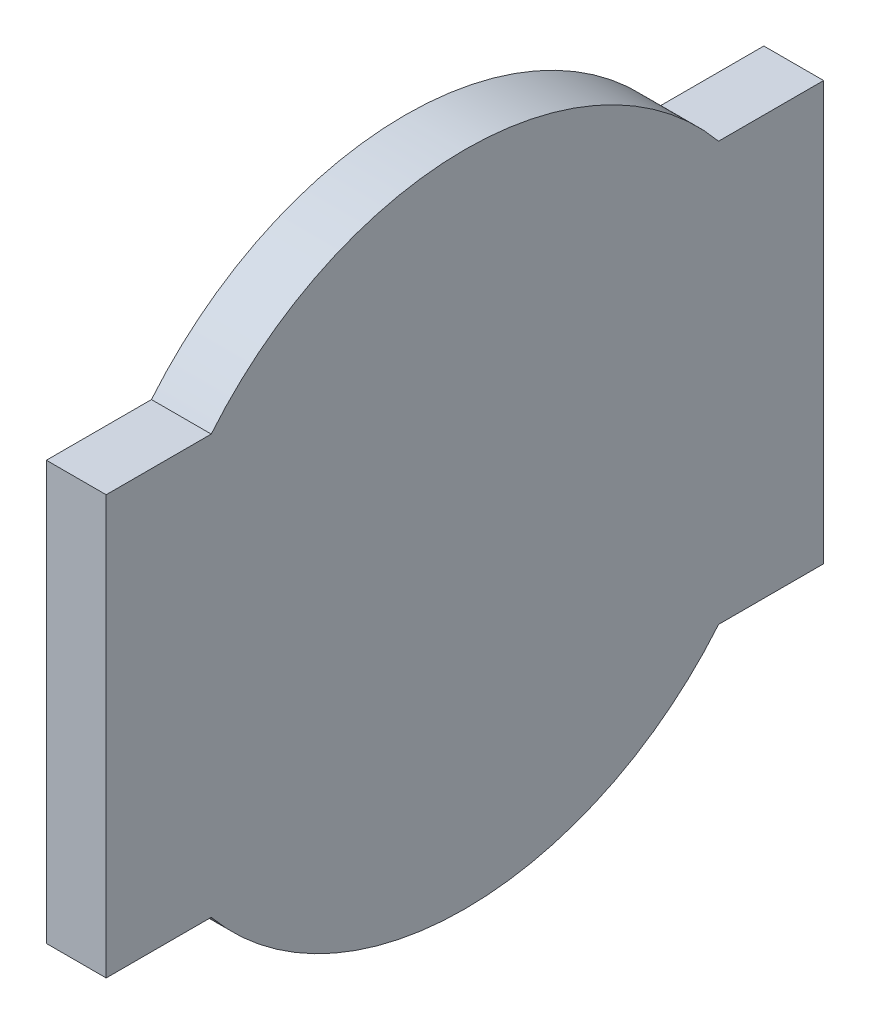
ISO-10303-21;
HEADER;
FILE_DESCRIPTION(('STEP AP214'),'2;1');
FILE_NAME('part.step','',(''),(''),'','','');
FILE_SCHEMA(('AUTOMOTIVE_DESIGN { 1 0 10303 214 1 1 1 1 }'));
ENDSEC;
DATA;
#1=APPLICATION_CONTEXT('core data for automotive mechanical design processes');
#2=APPLICATION_PROTOCOL_DEFINITION('international standard','automotive_design',2000,#1);
#3=PRODUCT_CONTEXT('',#1,'mechanical');
#4=PRODUCT('Part','Part','',(#3));
#5=PRODUCT_RELATED_PRODUCT_CATEGORY('part','',(#4));
#6=PRODUCT_DEFINITION_FORMATION('','',#4);
#7=PRODUCT_DEFINITION_CONTEXT('part definition',#1,'design');
#8=PRODUCT_DEFINITION('design','',#6,#7);
#9=PRODUCT_DEFINITION_SHAPE('','',#8);
#10=(LENGTH_UNIT() NAMED_UNIT(*) SI_UNIT(.MILLI.,.METRE.));
#11=(NAMED_UNIT(*) PLANE_ANGLE_UNIT() SI_UNIT($,.RADIAN.));
#12=(NAMED_UNIT(*) SI_UNIT($,.STERADIAN.) SOLID_ANGLE_UNIT());
#13=UNCERTAINTY_MEASURE_WITH_UNIT(LENGTH_MEASURE(1.E-05),#10,'distance_accuracy_value','');
#14=(GEOMETRIC_REPRESENTATION_CONTEXT(3) GLOBAL_UNCERTAINTY_ASSIGNED_CONTEXT((#13)) GLOBAL_UNIT_ASSIGNED_CONTEXT((#10,
#11,#12)) REPRESENTATION_CONTEXT('',''));
#15=CARTESIAN_POINT('',(0.,0.,0.));
#16=DIRECTION('',(0.,0.,1.));
#17=DIRECTION('',(1.,0.,0.));
#18=AXIS2_PLACEMENT_3D('',#15,#16,#17);
#19=CARTESIAN_POINT('',(6.35,22.225,0.));
#20=DIRECTION('',(0.,1.,0.));
#21=DIRECTION('',(0.,0.,1.));
#22=AXIS2_PLACEMENT_3D('',#19,#20,#21);
#23=PLANE('',#22);
#24=DIRECTION('',(0.,0.,-1.));
#25=VECTOR('',#24,1.);
#26=CARTESIAN_POINT('',(0.,22.225,0.));
#27=LINE('',#26,#25);
#28=CARTESIAN_POINT('',(0.,22.225,-26.9407683632075));
#29=VERTEX_POINT('',#28);
#30=CARTESIAN_POINT('',(0.,22.225,-38.1));
#31=VERTEX_POINT('',#30);
#32=EDGE_CURVE('E131',#29,#31,#27,.T.);
#33=ORIENTED_EDGE('',*,*,#32,.F.);
#34=DIRECTION('',(-1.,0.,0.));
#35=VECTOR('',#34,1.);
#36=CARTESIAN_POINT('',(6.35,22.225,-26.9407683632075));
#37=LINE('',#36,#35);
#38=CARTESIAN_POINT('',(6.35,22.225,-26.9407683632075));
#39=VERTEX_POINT('',#38);
#40=EDGE_CURVE('E11',#39,#29,#37,.T.);
#41=ORIENTED_EDGE('',*,*,#40,.F.);
#42=DIRECTION('',(0.,0.,-1.));
#43=VECTOR('',#42,1.);
#44=CARTESIAN_POINT('',(6.35,22.225,0.));
#45=LINE('',#44,#43);
#46=CARTESIAN_POINT('',(6.35,22.225,-38.1));
#47=VERTEX_POINT('',#46);
#48=EDGE_CURVE('E149',#39,#47,#45,.T.);
#49=ORIENTED_EDGE('',*,*,#48,.T.);
#50=DIRECTION('',(-1.,0.,0.));
#51=VECTOR('',#50,1.);
#52=CARTESIAN_POINT('',(6.35,22.225,-38.1));
#53=LINE('',#52,#51);
#54=EDGE_CURVE('E88',#47,#31,#53,.T.);
#55=ORIENTED_EDGE('',*,*,#54,.T.);
#56=EDGE_LOOP('',(#33,#41,#49,#55));
#57=FACE_BOUND('',#56,.T.);
#58=ADVANCED_FACE('F37',(#57),#23,.T.);
#59=CARTESIAN_POINT('',(6.35,0.,0.));
#60=DIRECTION('',(-1.,0.,0.));
#61=DIRECTION('',(0.,0.,1.));
#62=AXIS2_PLACEMENT_3D('',#59,#60,#61);
#63=CYLINDRICAL_SURFACE('',#62,34.925);
#64=CARTESIAN_POINT('',(0.,0.,0.));
#65=DIRECTION('',(1.,0.,0.));
#66=DIRECTION('',(0.,0.,-1.));
#67=AXIS2_PLACEMENT_3D('',#64,#65,#66);
#68=CIRCLE('',#67,34.925);
#69=CARTESIAN_POINT('',(0.,22.225,26.9407683632075));
#70=VERTEX_POINT('',#69);
#71=EDGE_CURVE('E134',#29,#70,#68,.T.);
#72=ORIENTED_EDGE('',*,*,#71,.T.);
#73=DIRECTION('',(-1.,0.,0.));
#74=VECTOR('',#73,1.);
#75=CARTESIAN_POINT('',(6.35,22.225,26.9407683632075));
#76=LINE('',#75,#74);
#77=CARTESIAN_POINT('',(6.35,22.225,26.9407683632075));
#78=VERTEX_POINT('',#77);
#79=EDGE_CURVE('E45',#78,#70,#76,.T.);
#80=ORIENTED_EDGE('',*,*,#79,.F.);
#81=CARTESIAN_POINT('',(6.35,0.,0.));
#82=DIRECTION('',(1.,0.,0.));
#83=DIRECTION('',(0.,0.,-1.));
#84=AXIS2_PLACEMENT_3D('',#81,#82,#83);
#85=CIRCLE('',#84,34.925);
#86=EDGE_CURVE('E174',#39,#78,#85,.T.);
#87=ORIENTED_EDGE('',*,*,#86,.F.);
#88=ORIENTED_EDGE('',*,*,#40,.T.);
#89=EDGE_LOOP('',(#72,#80,#87,#88));
#90=FACE_BOUND('',#89,.T.);
#91=ADVANCED_FACE('F165',(#90),#63,.T.);
#92=CARTESIAN_POINT('',(6.35,22.225,0.));
#93=DIRECTION('',(0.,1.,0.));
#94=DIRECTION('',(0.,0.,1.));
#95=AXIS2_PLACEMENT_3D('',#92,#93,#94);
#96=PLANE('',#95);
#97=DIRECTION('',(0.,0.,-1.));
#98=VECTOR('',#97,1.);
#99=CARTESIAN_POINT('',(0.,22.225,0.));
#100=LINE('',#99,#98);
#101=CARTESIAN_POINT('',(0.,22.225,38.1));
#102=VERTEX_POINT('',#101);
#103=EDGE_CURVE('E137',#102,#70,#100,.T.);
#104=ORIENTED_EDGE('',*,*,#103,.F.);
#105=DIRECTION('',(-1.,0.,0.));
#106=VECTOR('',#105,1.);
#107=CARTESIAN_POINT('',(6.35,22.225,38.1));
#108=LINE('',#107,#106);
#109=CARTESIAN_POINT('',(6.35,22.225,38.1));
#110=VERTEX_POINT('',#109);
#111=EDGE_CURVE('E155',#110,#102,#108,.T.);
#112=ORIENTED_EDGE('',*,*,#111,.F.);
#113=DIRECTION('',(0.,0.,-1.));
#114=VECTOR('',#113,1.);
#115=CARTESIAN_POINT('',(6.35,22.225,0.));
#116=LINE('',#115,#114);
#117=EDGE_CURVE('E162',#110,#78,#116,.T.);
#118=ORIENTED_EDGE('',*,*,#117,.T.);
#119=ORIENTED_EDGE('',*,*,#79,.T.);
#120=EDGE_LOOP('',(#104,#112,#118,#119));
#121=FACE_BOUND('',#120,.T.);
#122=ADVANCED_FACE('F160',(#121),#96,.T.);
#123=CARTESIAN_POINT('',(6.35,0.,38.1));
#124=DIRECTION('',(0.,0.,1.));
#125=DIRECTION('',(1.,0.,0.));
#126=AXIS2_PLACEMENT_3D('',#123,#124,#125);
#127=PLANE('',#126);
#128=DIRECTION('',(0.,1.,0.));
#129=VECTOR('',#128,1.);
#130=CARTESIAN_POINT('',(0.,0.,38.1));
#131=LINE('',#130,#129);
#132=CARTESIAN_POINT('',(0.,-22.225,38.1));
#133=VERTEX_POINT('',#132);
#134=EDGE_CURVE('E140',#133,#102,#131,.T.);
#135=ORIENTED_EDGE('',*,*,#134,.F.);
#136=DIRECTION('',(-1.,0.,0.));
#137=VECTOR('',#136,1.);
#138=CARTESIAN_POINT('',(6.35,-22.225,38.1));
#139=LINE('',#138,#137);
#140=CARTESIAN_POINT('',(6.35,-22.225,38.1));
#141=VERTEX_POINT('',#140);
#142=EDGE_CURVE('E153',#141,#133,#139,.T.);
#143=ORIENTED_EDGE('',*,*,#142,.F.);
#144=DIRECTION('',(0.,1.,0.));
#145=VECTOR('',#144,1.);
#146=CARTESIAN_POINT('',(6.35,0.,38.1));
#147=LINE('',#146,#145);
#148=EDGE_CURVE('E173',#141,#110,#147,.T.);
#149=ORIENTED_EDGE('',*,*,#148,.T.);
#150=ORIENTED_EDGE('',*,*,#111,.T.);
#151=EDGE_LOOP('',(#135,#143,#149,#150));
#152=FACE_BOUND('',#151,.T.);
#153=ADVANCED_FACE('F171',(#152),#127,.T.);
#154=CARTESIAN_POINT('',(6.35,-22.225,0.));
#155=DIRECTION('',(0.,1.,0.));
#156=DIRECTION('',(0.,0.,1.));
#157=AXIS2_PLACEMENT_3D('',#154,#155,#156);
#158=PLANE('',#157);
#159=DIRECTION('',(0.,0.,-1.));
#160=VECTOR('',#159,1.);
#161=CARTESIAN_POINT('',(0.,-22.225,0.));
#162=LINE('',#161,#160);
#163=CARTESIAN_POINT('',(0.,-22.225,26.9407683632075));
#164=VERTEX_POINT('',#163);
#165=EDGE_CURVE('E143',#133,#164,#162,.T.);
#166=ORIENTED_EDGE('',*,*,#165,.T.);
#167=DIRECTION('',(-1.,0.,0.));
#168=VECTOR('',#167,1.);
#169=CARTESIAN_POINT('',(6.35,-22.225,26.9407683632075));
#170=LINE('',#169,#168);
#171=CARTESIAN_POINT('',(6.35,-22.225,26.9407683632075));
#172=VERTEX_POINT('',#171);
#173=EDGE_CURVE('E123',#172,#164,#170,.T.);
#174=ORIENTED_EDGE('',*,*,#173,.F.);
#175=DIRECTION('',(0.,0.,-1.));
#176=VECTOR('',#175,1.);
#177=CARTESIAN_POINT('',(6.35,-22.225,0.));
#178=LINE('',#177,#176);
#179=EDGE_CURVE('E114',#141,#172,#178,.T.);
#180=ORIENTED_EDGE('',*,*,#179,.F.);
#181=ORIENTED_EDGE('',*,*,#142,.T.);
#182=EDGE_LOOP('',(#166,#174,#180,#181));
#183=FACE_BOUND('',#182,.T.);
#184=ADVANCED_FACE('F190',(#183),#158,.F.);
#185=CARTESIAN_POINT('',(6.35,0.,0.));
#186=DIRECTION('',(-1.,0.,0.));
#187=DIRECTION('',(0.,0.,1.));
#188=AXIS2_PLACEMENT_3D('',#185,#186,#187);
#189=CYLINDRICAL_SURFACE('',#188,34.925);
#190=CARTESIAN_POINT('',(0.,0.,0.));
#191=DIRECTION('',(1.,0.,0.));
#192=DIRECTION('',(0.,0.,-1.));
#193=AXIS2_PLACEMENT_3D('',#190,#191,#192);
#194=CIRCLE('',#193,34.925);
#195=CARTESIAN_POINT('',(0.,-22.225,-26.9407683632075));
#196=VERTEX_POINT('',#195);
#197=EDGE_CURVE('E122',#164,#196,#194,.T.);
#198=ORIENTED_EDGE('',*,*,#197,.T.);
#199=DIRECTION('',(-1.,0.,0.));
#200=VECTOR('',#199,1.);
#201=CARTESIAN_POINT('',(6.35,-22.225,-26.9407683632075));
#202=LINE('',#201,#200);
#203=CARTESIAN_POINT('',(6.35,-22.225,-26.9407683632075));
#204=VERTEX_POINT('',#203);
#205=EDGE_CURVE('E119',#204,#196,#202,.T.);
#206=ORIENTED_EDGE('',*,*,#205,.F.);
#207=CARTESIAN_POINT('',(6.35,0.,0.));
#208=DIRECTION('',(1.,0.,0.));
#209=DIRECTION('',(0.,0.,-1.));
#210=AXIS2_PLACEMENT_3D('',#207,#208,#209);
#211=CIRCLE('',#210,34.925);
#212=EDGE_CURVE('E107',#172,#204,#211,.T.);
#213=ORIENTED_EDGE('',*,*,#212,.F.);
#214=ORIENTED_EDGE('',*,*,#173,.T.);
#215=EDGE_LOOP('',(#198,#206,#213,#214));
#216=FACE_BOUND('',#215,.T.);
#217=ADVANCED_FACE('F120',(#216),#189,.T.);
#218=CARTESIAN_POINT('',(6.35,-22.225,0.));
#219=DIRECTION('',(0.,1.,0.));
#220=DIRECTION('',(0.,0.,1.));
#221=AXIS2_PLACEMENT_3D('',#218,#219,#220);
#222=PLANE('',#221);
#223=DIRECTION('',(0.,0.,-1.));
#224=VECTOR('',#223,1.);
#225=CARTESIAN_POINT('',(0.,-22.225,0.));
#226=LINE('',#225,#224);
#227=CARTESIAN_POINT('',(0.,-22.225,-38.1));
#228=VERTEX_POINT('',#227);
#229=EDGE_CURVE('E81',#196,#228,#226,.T.);
#230=ORIENTED_EDGE('',*,*,#229,.T.);
#231=DIRECTION('',(-1.,0.,0.));
#232=VECTOR('',#231,1.);
#233=CARTESIAN_POINT('',(6.35,-22.225,-38.1));
#234=LINE('',#233,#232);
#235=CARTESIAN_POINT('',(6.35,-22.225,-38.1));
#236=VERTEX_POINT('',#235);
#237=EDGE_CURVE('E124',#236,#228,#234,.T.);
#238=ORIENTED_EDGE('',*,*,#237,.F.);
#239=DIRECTION('',(0.,0.,-1.));
#240=VECTOR('',#239,1.);
#241=CARTESIAN_POINT('',(6.35,-22.225,0.));
#242=LINE('',#241,#240);
#243=EDGE_CURVE('E111',#204,#236,#242,.T.);
#244=ORIENTED_EDGE('',*,*,#243,.F.);
#245=ORIENTED_EDGE('',*,*,#205,.T.);
#246=EDGE_LOOP('',(#230,#238,#244,#245));
#247=FACE_BOUND('',#246,.T.);
#248=ADVANCED_FACE('F126',(#247),#222,.F.);
#249=CARTESIAN_POINT('',(6.35,0.,-38.1));
#250=DIRECTION('',(0.,0.,1.));
#251=DIRECTION('',(1.,0.,0.));
#252=AXIS2_PLACEMENT_3D('',#249,#250,#251);
#253=PLANE('',#252);
#254=DIRECTION('',(0.,1.,0.));
#255=VECTOR('',#254,1.);
#256=CARTESIAN_POINT('',(0.,0.,-38.1));
#257=LINE('',#256,#255);
#258=EDGE_CURVE('E147',#228,#31,#257,.T.);
#259=ORIENTED_EDGE('',*,*,#258,.T.);
#260=ORIENTED_EDGE('',*,*,#54,.F.);
#261=DIRECTION('',(0.,1.,0.));
#262=VECTOR('',#261,1.);
#263=CARTESIAN_POINT('',(6.35,0.,-38.1));
#264=LINE('',#263,#262);
#265=EDGE_CURVE('E53',#236,#47,#264,.T.);
#266=ORIENTED_EDGE('',*,*,#265,.F.);
#267=ORIENTED_EDGE('',*,*,#237,.T.);
#268=EDGE_LOOP('',(#259,#260,#266,#267));
#269=FACE_BOUND('',#268,.T.);
#270=ADVANCED_FACE('F198',(#269),#253,.F.);
#271=CARTESIAN_POINT('',(6.35,0.,0.));
#272=DIRECTION('',(1.,0.,0.));
#273=DIRECTION('',(0.,0.,-1.));
#274=AXIS2_PLACEMENT_3D('',#271,#272,#273);
#275=PLANE('',#274);
#276=ORIENTED_EDGE('',*,*,#48,.F.);
#277=ORIENTED_EDGE('',*,*,#86,.T.);
#278=ORIENTED_EDGE('',*,*,#117,.F.);
#279=ORIENTED_EDGE('',*,*,#148,.F.);
#280=ORIENTED_EDGE('',*,*,#179,.T.);
#281=ORIENTED_EDGE('',*,*,#212,.T.);
#282=ORIENTED_EDGE('',*,*,#243,.T.);
#283=ORIENTED_EDGE('',*,*,#265,.T.);
#284=EDGE_LOOP('',(#276,#277,#278,#279,#280,#281,#282,#283));
#285=FACE_BOUND('',#284,.T.);
#286=ADVANCED_FACE('F109',(#285),#275,.T.);
#287=CARTESIAN_POINT('',(0.,0.,0.));
#288=DIRECTION('',(1.,0.,0.));
#289=DIRECTION('',(0.,0.,-1.));
#290=AXIS2_PLACEMENT_3D('',#287,#288,#289);
#291=PLANE('',#290);
#292=ORIENTED_EDGE('',*,*,#32,.T.);
#293=ORIENTED_EDGE('',*,*,#258,.F.);
#294=ORIENTED_EDGE('',*,*,#229,.F.);
#295=ORIENTED_EDGE('',*,*,#197,.F.);
#296=ORIENTED_EDGE('',*,*,#165,.F.);
#297=ORIENTED_EDGE('',*,*,#134,.T.);
#298=ORIENTED_EDGE('',*,*,#103,.T.);
#299=ORIENTED_EDGE('',*,*,#71,.F.);
#300=EDGE_LOOP('',(#292,#293,#294,#295,#296,#297,#298,#299));
#301=FACE_BOUND('',#300,.T.);
#302=ADVANCED_FACE('F167',(#301),#291,.F.);
#303=CLOSED_SHELL('',(#58,#91,#122,#153,#184,#217,#248,#270,#286,#302));
#304=MANIFOLD_SOLID_BREP('B2',#303);
#305=ADVANCED_BREP_SHAPE_REPRESENTATION('',(#18,#304),#14);
#306=SHAPE_DEFINITION_REPRESENTATION(#9,#305);
ENDSEC;
END-ISO-10303-21;
